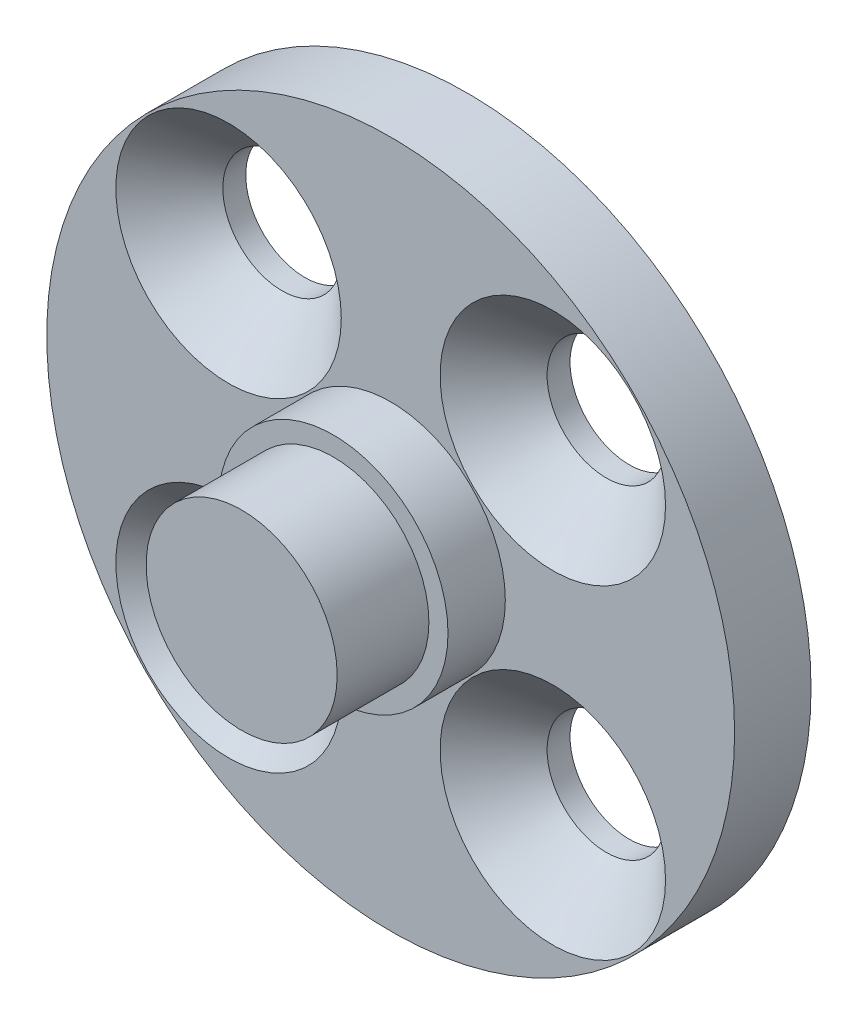
ISO-10303-21;
HEADER;
FILE_DESCRIPTION(('STEP AP214'),'2;1');
FILE_NAME('part.step','',(''),(''),'','','');
FILE_SCHEMA(('AUTOMOTIVE_DESIGN { 1 0 10303 214 1 1 1 1 }'));
ENDSEC;
DATA;
#1=APPLICATION_CONTEXT('core data for automotive mechanical design processes');
#2=APPLICATION_PROTOCOL_DEFINITION('international standard','automotive_design',2000,#1);
#3=PRODUCT_CONTEXT('',#1,'mechanical');
#4=PRODUCT('Part','Part','',(#3));
#5=PRODUCT_RELATED_PRODUCT_CATEGORY('part','',(#4));
#6=PRODUCT_DEFINITION_FORMATION('','',#4);
#7=PRODUCT_DEFINITION_CONTEXT('part definition',#1,'design');
#8=PRODUCT_DEFINITION('design','',#6,#7);
#9=PRODUCT_DEFINITION_SHAPE('','',#8);
#10=(LENGTH_UNIT() NAMED_UNIT(*) SI_UNIT(.MILLI.,.METRE.));
#11=(NAMED_UNIT(*) PLANE_ANGLE_UNIT() SI_UNIT($,.RADIAN.));
#12=(NAMED_UNIT(*) SI_UNIT($,.STERADIAN.) SOLID_ANGLE_UNIT());
#13=UNCERTAINTY_MEASURE_WITH_UNIT(LENGTH_MEASURE(1.E-05),#10,'distance_accuracy_value','');
#14=(GEOMETRIC_REPRESENTATION_CONTEXT(3) GLOBAL_UNCERTAINTY_ASSIGNED_CONTEXT((#13)) GLOBAL_UNIT_ASSIGNED_CONTEXT((#10,
#11,#12)) REPRESENTATION_CONTEXT('',''));
#15=CARTESIAN_POINT('',(0.,0.,0.));
#16=DIRECTION('',(0.,0.,1.));
#17=DIRECTION('',(1.,0.,0.));
#18=AXIS2_PLACEMENT_3D('',#15,#16,#17);
#19=CARTESIAN_POINT('',(0.,0.,2.));
#20=DIRECTION('',(0.,0.,1.));
#21=DIRECTION('',(1.,0.,0.));
#22=AXIS2_PLACEMENT_3D('',#19,#20,#21);
#23=PLANE('',#22);
#24=CARTESIAN_POINT('',(-4.24264068711928,4.24264068711928,2.));
#25=DIRECTION('',(0.,0.,1.));
#26=DIRECTION('',(1.,0.,0.));
#27=AXIS2_PLACEMENT_3D('',#24,#25,#26);
#28=CIRCLE('',#27,2.95);
#29=CARTESIAN_POINT('',(-1.29264068711928,4.24264068711928,2.));
#30=VERTEX_POINT('',#29);
#31=EDGE_CURVE('E63',#30,#30,#28,.F.);
#32=ORIENTED_EDGE('',*,*,#31,.T.);
#33=EDGE_LOOP('',(#32));
#34=FACE_BOUND('',#33,.T.);
#35=CARTESIAN_POINT('',(-4.24264068711928,-4.24264068711928,2.));
#36=DIRECTION('',(0.,0.,1.));
#37=DIRECTION('',(1.,0.,0.));
#38=AXIS2_PLACEMENT_3D('',#35,#36,#37);
#39=CIRCLE('',#38,2.95);
#40=CARTESIAN_POINT('',(-1.29264068711928,-4.24264068711928,2.));
#41=VERTEX_POINT('',#40);
#42=EDGE_CURVE('E69',#41,#41,#39,.F.);
#43=ORIENTED_EDGE('',*,*,#42,.T.);
#44=EDGE_LOOP('',(#43));
#45=FACE_BOUND('',#44,.T.);
#46=CARTESIAN_POINT('',(4.24264068711928,-4.24264068711928,2.));
#47=DIRECTION('',(0.,0.,1.));
#48=DIRECTION('',(1.,0.,0.));
#49=AXIS2_PLACEMENT_3D('',#46,#47,#48);
#50=CIRCLE('',#49,2.95);
#51=CARTESIAN_POINT('',(7.19264068711929,-4.24264068711928,2.));
#52=VERTEX_POINT('',#51);
#53=EDGE_CURVE('E73',#52,#52,#50,.F.);
#54=ORIENTED_EDGE('',*,*,#53,.T.);
#55=EDGE_LOOP('',(#54));
#56=FACE_BOUND('',#55,.T.);
#57=CARTESIAN_POINT('',(4.24264068711928,4.24264068711928,2.));
#58=DIRECTION('',(0.,0.,1.));
#59=DIRECTION('',(1.,0.,0.));
#60=AXIS2_PLACEMENT_3D('',#57,#58,#59);
#61=CIRCLE('',#60,2.95);
#62=CARTESIAN_POINT('',(7.19264068711929,4.24264068711928,2.));
#63=VERTEX_POINT('',#62);
#64=EDGE_CURVE('E77',#63,#63,#61,.F.);
#65=ORIENTED_EDGE('',*,*,#64,.T.);
#66=EDGE_LOOP('',(#65));
#67=FACE_BOUND('',#66,.T.);
#68=CARTESIAN_POINT('',(0.,0.,2.));
#69=DIRECTION('',(0.,0.,1.));
#70=DIRECTION('',(1.,0.,0.));
#71=AXIS2_PLACEMENT_3D('',#68,#69,#70);
#72=CIRCLE('',#71,3.);
#73=CARTESIAN_POINT('',(3.,0.,2.));
#74=VERTEX_POINT('',#73);
#75=EDGE_CURVE('E111',#74,#74,#72,.T.);
#76=ORIENTED_EDGE('',*,*,#75,.F.);
#77=EDGE_LOOP('',(#76));
#78=FACE_BOUND('',#77,.T.);
#79=CARTESIAN_POINT('',(0.,0.,2.));
#80=DIRECTION('',(0.,0.,1.));
#81=DIRECTION('',(1.,0.,0.));
#82=AXIS2_PLACEMENT_3D('',#79,#80,#81);
#83=CIRCLE('',#82,9.);
#84=CARTESIAN_POINT('',(9.,0.,2.));
#85=VERTEX_POINT('',#84);
#86=EDGE_CURVE('E90',#85,#85,#83,.T.);
#87=ORIENTED_EDGE('',*,*,#86,.T.);
#88=EDGE_LOOP('',(#87));
#89=FACE_BOUND('',#88,.T.);
#90=ADVANCED_FACE('F44',(#34,#45,#56,#67,#78,#89),#23,.T.);
#91=CARTESIAN_POINT('',(0.,0.,0.));
#92=DIRECTION('',(0.,0.,1.));
#93=DIRECTION('',(1.,0.,0.));
#94=AXIS2_PLACEMENT_3D('',#91,#92,#93);
#95=PLANE('',#94);
#96=CARTESIAN_POINT('',(0.,0.,0.));
#97=DIRECTION('',(0.,0.,1.));
#98=DIRECTION('',(1.,0.,0.));
#99=AXIS2_PLACEMENT_3D('',#96,#97,#98);
#100=CIRCLE('',#99,9.);
#101=CARTESIAN_POINT('',(9.,0.,0.));
#102=VERTEX_POINT('',#101);
#103=EDGE_CURVE('E86',#102,#102,#100,.T.);
#104=ORIENTED_EDGE('',*,*,#103,.F.);
#105=EDGE_LOOP('',(#104));
#106=FACE_BOUND('',#105,.T.);
#107=CARTESIAN_POINT('',(-4.24264068711928,4.24264068711928,0.));
#108=DIRECTION('',(0.,0.,1.));
#109=DIRECTION('',(1.,0.,0.));
#110=AXIS2_PLACEMENT_3D('',#107,#108,#109);
#111=CIRCLE('',#110,1.55);
#112=CARTESIAN_POINT('',(-2.69264068711928,4.24264068711928,0.));
#113=VERTEX_POINT('',#112);
#114=EDGE_CURVE('E91',#113,#113,#111,.T.);
#115=ORIENTED_EDGE('',*,*,#114,.T.);
#116=EDGE_LOOP('',(#115));
#117=FACE_BOUND('',#116,.T.);
#118=CARTESIAN_POINT('',(-4.24264068711928,-4.24264068711928,0.));
#119=DIRECTION('',(0.,0.,1.));
#120=DIRECTION('',(1.,0.,0.));
#121=AXIS2_PLACEMENT_3D('',#118,#119,#120);
#122=CIRCLE('',#121,1.55);
#123=CARTESIAN_POINT('',(-2.69264068711928,-4.24264068711928,0.));
#124=VERTEX_POINT('',#123);
#125=EDGE_CURVE('E98',#124,#124,#122,.T.);
#126=ORIENTED_EDGE('',*,*,#125,.T.);
#127=EDGE_LOOP('',(#126));
#128=FACE_BOUND('',#127,.T.);
#129=CARTESIAN_POINT('',(4.24264068711928,4.24264068711928,0.));
#130=DIRECTION('',(0.,0.,1.));
#131=DIRECTION('',(1.,0.,0.));
#132=AXIS2_PLACEMENT_3D('',#129,#130,#131);
#133=CIRCLE('',#132,1.55);
#134=CARTESIAN_POINT('',(5.79264068711928,4.24264068711928,0.));
#135=VERTEX_POINT('',#134);
#136=EDGE_CURVE('E102',#135,#135,#133,.T.);
#137=ORIENTED_EDGE('',*,*,#136,.T.);
#138=EDGE_LOOP('',(#137));
#139=FACE_BOUND('',#138,.T.);
#140=CARTESIAN_POINT('',(4.24264068711928,-4.24264068711928,0.));
#141=DIRECTION('',(0.,0.,1.));
#142=DIRECTION('',(1.,0.,0.));
#143=AXIS2_PLACEMENT_3D('',#140,#141,#142);
#144=CIRCLE('',#143,1.55);
#145=CARTESIAN_POINT('',(5.79264068711928,-4.24264068711928,0.));
#146=VERTEX_POINT('',#145);
#147=EDGE_CURVE('E106',#146,#146,#144,.T.);
#148=ORIENTED_EDGE('',*,*,#147,.T.);
#149=EDGE_LOOP('',(#148));
#150=FACE_BOUND('',#149,.T.);
#151=ADVANCED_FACE('F149',(#106,#117,#128,#139,#150),#95,.F.);
#152=CARTESIAN_POINT('',(0.,0.,2.));
#153=DIRECTION('',(0.,0.,-1.));
#154=DIRECTION('',(-1.,0.,0.));
#155=AXIS2_PLACEMENT_3D('',#152,#153,#154);
#156=CYLINDRICAL_SURFACE('',#155,9.);
#157=ORIENTED_EDGE('',*,*,#86,.F.);
#158=EDGE_LOOP('',(#157));
#159=FACE_BOUND('',#158,.T.);
#160=ORIENTED_EDGE('',*,*,#103,.T.);
#161=EDGE_LOOP('',(#160));
#162=FACE_BOUND('',#161,.T.);
#163=ADVANCED_FACE('F154',(#159,#162),#156,.T.);
#164=CARTESIAN_POINT('',(-4.24264068711928,4.24264068711928,2.));
#165=DIRECTION('',(0.,0.,-1.));
#166=DIRECTION('',(-1.,0.,0.));
#167=AXIS2_PLACEMENT_3D('',#164,#165,#166);
#168=CYLINDRICAL_SURFACE('',#167,1.55);
#169=CARTESIAN_POINT('',(-4.24264068711928,4.24264068711928,0.600000000000001));
#170=DIRECTION('',(0.,0.,1.));
#171=DIRECTION('',(1.,0.,0.));
#172=AXIS2_PLACEMENT_3D('',#169,#170,#171);
#173=CIRCLE('',#172,1.55);
#174=CARTESIAN_POINT('',(-2.69264068711928,4.24264068711928,0.600000000000001));
#175=VERTEX_POINT('',#174);
#176=EDGE_CURVE('E81',#175,#175,#173,.T.);
#177=ORIENTED_EDGE('',*,*,#176,.T.);
#178=EDGE_LOOP('',(#177));
#179=FACE_BOUND('',#178,.T.);
#180=ORIENTED_EDGE('',*,*,#114,.F.);
#181=EDGE_LOOP('',(#180));
#182=FACE_BOUND('',#181,.T.);
#183=ADVANCED_FACE('F157',(#179,#182),#168,.F.);
#184=CARTESIAN_POINT('',(-4.24264068711928,-4.24264068711928,2.));
#185=DIRECTION('',(0.,0.,-1.));
#186=DIRECTION('',(-1.,0.,0.));
#187=AXIS2_PLACEMENT_3D('',#184,#185,#186);
#188=CYLINDRICAL_SURFACE('',#187,1.55);
#189=CARTESIAN_POINT('',(-4.24264068711928,-4.24264068711928,0.600000000000001));
#190=DIRECTION('',(0.,0.,1.));
#191=DIRECTION('',(1.,0.,0.));
#192=AXIS2_PLACEMENT_3D('',#189,#190,#191);
#193=CIRCLE('',#192,1.55);
#194=CARTESIAN_POINT('',(-2.69264068711928,-4.24264068711928,0.600000000000001));
#195=VERTEX_POINT('',#194);
#196=EDGE_CURVE('E58',#195,#195,#193,.T.);
#197=ORIENTED_EDGE('',*,*,#196,.T.);
#198=EDGE_LOOP('',(#197));
#199=FACE_BOUND('',#198,.T.);
#200=ORIENTED_EDGE('',*,*,#125,.F.);
#201=EDGE_LOOP('',(#200));
#202=FACE_BOUND('',#201,.T.);
#203=ADVANCED_FACE('F179',(#199,#202),#188,.F.);
#204=CARTESIAN_POINT('',(4.24264068711928,4.24264068711928,2.));
#205=DIRECTION('',(0.,0.,-1.));
#206=DIRECTION('',(-1.,0.,0.));
#207=AXIS2_PLACEMENT_3D('',#204,#205,#206);
#208=CYLINDRICAL_SURFACE('',#207,1.55);
#209=CARTESIAN_POINT('',(4.24264068711928,4.24264068711928,0.600000000000001));
#210=DIRECTION('',(0.,0.,1.));
#211=DIRECTION('',(1.,0.,0.));
#212=AXIS2_PLACEMENT_3D('',#209,#210,#211);
#213=CIRCLE('',#212,1.55);
#214=CARTESIAN_POINT('',(5.79264068711928,4.24264068711928,0.600000000000001));
#215=VERTEX_POINT('',#214);
#216=EDGE_CURVE('E10',#215,#215,#213,.T.);
#217=ORIENTED_EDGE('',*,*,#216,.T.);
#218=EDGE_LOOP('',(#217));
#219=FACE_BOUND('',#218,.T.);
#220=ORIENTED_EDGE('',*,*,#136,.F.);
#221=EDGE_LOOP('',(#220));
#222=FACE_BOUND('',#221,.T.);
#223=ADVANCED_FACE('F173',(#219,#222),#208,.F.);
#224=CARTESIAN_POINT('',(4.24264068711928,-4.24264068711928,2.));
#225=DIRECTION('',(0.,0.,-1.));
#226=DIRECTION('',(-1.,0.,0.));
#227=AXIS2_PLACEMENT_3D('',#224,#225,#226);
#228=CYLINDRICAL_SURFACE('',#227,1.55);
#229=CARTESIAN_POINT('',(4.24264068711928,-4.24264068711928,0.600000000000001));
#230=DIRECTION('',(0.,0.,1.));
#231=DIRECTION('',(1.,0.,0.));
#232=AXIS2_PLACEMENT_3D('',#229,#230,#231);
#233=CIRCLE('',#232,1.55);
#234=CARTESIAN_POINT('',(5.79264068711928,-4.24264068711928,0.600000000000001));
#235=VERTEX_POINT('',#234);
#236=EDGE_CURVE('E53',#235,#235,#233,.T.);
#237=ORIENTED_EDGE('',*,*,#236,.T.);
#238=EDGE_LOOP('',(#237));
#239=FACE_BOUND('',#238,.T.);
#240=ORIENTED_EDGE('',*,*,#147,.F.);
#241=EDGE_LOOP('',(#240));
#242=FACE_BOUND('',#241,.T.);
#243=ADVANCED_FACE('F143',(#239,#242),#228,.F.);
#244=CARTESIAN_POINT('',(0.,0.,3.5));
#245=DIRECTION('',(0.,0.,-1.));
#246=DIRECTION('',(-1.,0.,0.));
#247=AXIS2_PLACEMENT_3D('',#244,#245,#246);
#248=CYLINDRICAL_SURFACE('',#247,3.);
#249=CARTESIAN_POINT('',(0.,0.,3.5));
#250=DIRECTION('',(0.,0.,1.));
#251=DIRECTION('',(1.,0.,0.));
#252=AXIS2_PLACEMENT_3D('',#249,#250,#251);
#253=CIRCLE('',#252,3.);
#254=CARTESIAN_POINT('',(3.,0.,3.5));
#255=VERTEX_POINT('',#254);
#256=EDGE_CURVE('E110',#255,#255,#253,.T.);
#257=ORIENTED_EDGE('',*,*,#256,.F.);
#258=EDGE_LOOP('',(#257));
#259=FACE_BOUND('',#258,.T.);
#260=ORIENTED_EDGE('',*,*,#75,.T.);
#261=EDGE_LOOP('',(#260));
#262=FACE_BOUND('',#261,.T.);
#263=ADVANCED_FACE('F137',(#259,#262),#248,.T.);
#264=CARTESIAN_POINT('',(0.,0.,3.5));
#265=DIRECTION('',(0.,0.,1.));
#266=DIRECTION('',(1.,0.,0.));
#267=AXIS2_PLACEMENT_3D('',#264,#265,#266);
#268=PLANE('',#267);
#269=CARTESIAN_POINT('',(0.,0.,3.5));
#270=DIRECTION('',(0.,0.,1.));
#271=DIRECTION('',(1.,0.,0.));
#272=AXIS2_PLACEMENT_3D('',#269,#270,#271);
#273=CIRCLE('',#272,2.5);
#274=CARTESIAN_POINT('',(2.5,0.,3.5));
#275=VERTEX_POINT('',#274);
#276=EDGE_CURVE('E85',#275,#275,#273,.T.);
#277=ORIENTED_EDGE('',*,*,#276,.F.);
#278=EDGE_LOOP('',(#277));
#279=FACE_BOUND('',#278,.T.);
#280=ORIENTED_EDGE('',*,*,#256,.T.);
#281=EDGE_LOOP('',(#280));
#282=FACE_BOUND('',#281,.T.);
#283=ADVANCED_FACE('F131',(#279,#282),#268,.T.);
#284=CARTESIAN_POINT('',(0.,0.,5.9));
#285=DIRECTION('',(0.,0.,-1.));
#286=DIRECTION('',(-1.,0.,0.));
#287=AXIS2_PLACEMENT_3D('',#284,#285,#286);
#288=CYLINDRICAL_SURFACE('',#287,2.5);
#289=CARTESIAN_POINT('',(0.,0.,5.9));
#290=DIRECTION('',(0.,0.,1.));
#291=DIRECTION('',(1.,0.,0.));
#292=AXIS2_PLACEMENT_3D('',#289,#290,#291);
#293=CIRCLE('',#292,2.5);
#294=CARTESIAN_POINT('',(2.5,0.,5.9));
#295=VERTEX_POINT('',#294);
#296=EDGE_CURVE('E115',#295,#295,#293,.T.);
#297=ORIENTED_EDGE('',*,*,#296,.F.);
#298=EDGE_LOOP('',(#297));
#299=FACE_BOUND('',#298,.T.);
#300=ORIENTED_EDGE('',*,*,#276,.T.);
#301=EDGE_LOOP('',(#300));
#302=FACE_BOUND('',#301,.T.);
#303=ADVANCED_FACE('F128',(#299,#302),#288,.T.);
#304=CARTESIAN_POINT('',(0.,0.,5.9));
#305=DIRECTION('',(0.,0.,1.));
#306=DIRECTION('',(1.,0.,0.));
#307=AXIS2_PLACEMENT_3D('',#304,#305,#306);
#308=PLANE('',#307);
#309=ORIENTED_EDGE('',*,*,#296,.T.);
#310=EDGE_LOOP('',(#309));
#311=FACE_BOUND('',#310,.T.);
#312=ADVANCED_FACE('F126',(#311),#308,.T.);
#313=CARTESIAN_POINT('',(-4.24264068711928,4.24264068711928,0.600000000000001));
#314=DIRECTION('',(0.,0.,1.));
#315=DIRECTION('',(1.,0.,0.));
#316=AXIS2_PLACEMENT_3D('',#313,#314,#315);
#317=CONICAL_SURFACE('',#316,1.55,0.78539816339745);
#318=ORIENTED_EDGE('',*,*,#31,.F.);
#319=EDGE_LOOP('',(#318));
#320=FACE_BOUND('',#319,.T.);
#321=ORIENTED_EDGE('',*,*,#176,.F.);
#322=EDGE_LOOP('',(#321));
#323=FACE_BOUND('',#322,.T.);
#324=ADVANCED_FACE('F189',(#320,#323),#317,.F.);
#325=CARTESIAN_POINT('',(-4.24264068711928,-4.24264068711928,0.600000000000001));
#326=DIRECTION('',(0.,0.,1.));
#327=DIRECTION('',(1.,0.,0.));
#328=AXIS2_PLACEMENT_3D('',#325,#326,#327);
#329=CONICAL_SURFACE('',#328,1.55,0.78539816339745);
#330=ORIENTED_EDGE('',*,*,#42,.F.);
#331=EDGE_LOOP('',(#330));
#332=FACE_BOUND('',#331,.T.);
#333=ORIENTED_EDGE('',*,*,#196,.F.);
#334=EDGE_LOOP('',(#333));
#335=FACE_BOUND('',#334,.T.);
#336=ADVANCED_FACE('F194',(#332,#335),#329,.F.);
#337=CARTESIAN_POINT('',(4.24264068711928,-4.24264068711928,0.600000000000001));
#338=DIRECTION('',(0.,0.,1.));
#339=DIRECTION('',(1.,0.,0.));
#340=AXIS2_PLACEMENT_3D('',#337,#338,#339);
#341=CONICAL_SURFACE('',#340,1.55,0.78539816339745);
#342=ORIENTED_EDGE('',*,*,#53,.F.);
#343=EDGE_LOOP('',(#342));
#344=FACE_BOUND('',#343,.T.);
#345=ORIENTED_EDGE('',*,*,#236,.F.);
#346=EDGE_LOOP('',(#345));
#347=FACE_BOUND('',#346,.T.);
#348=ADVANCED_FACE('F200',(#344,#347),#341,.F.);
#349=CARTESIAN_POINT('',(4.24264068711928,4.24264068711928,0.600000000000001));
#350=DIRECTION('',(0.,0.,1.));
#351=DIRECTION('',(1.,0.,0.));
#352=AXIS2_PLACEMENT_3D('',#349,#350,#351);
#353=CONICAL_SURFACE('',#352,1.55,0.78539816339745);
#354=ORIENTED_EDGE('',*,*,#64,.F.);
#355=EDGE_LOOP('',(#354));
#356=FACE_BOUND('',#355,.T.);
#357=ORIENTED_EDGE('',*,*,#216,.F.);
#358=EDGE_LOOP('',(#357));
#359=FACE_BOUND('',#358,.T.);
#360=ADVANCED_FACE('F47',(#356,#359),#353,.F.);
#361=CLOSED_SHELL('',(#90,#151,#163,#183,#203,#223,#243,#263,#283,#303,#312,#324,#336,#348,#360));
#362=MANIFOLD_SOLID_BREP('B2',#361);
#363=ADVANCED_BREP_SHAPE_REPRESENTATION('',(#18,#362),#14);
#364=SHAPE_DEFINITION_REPRESENTATION(#9,#363);
ENDSEC;
END-ISO-10303-21;
